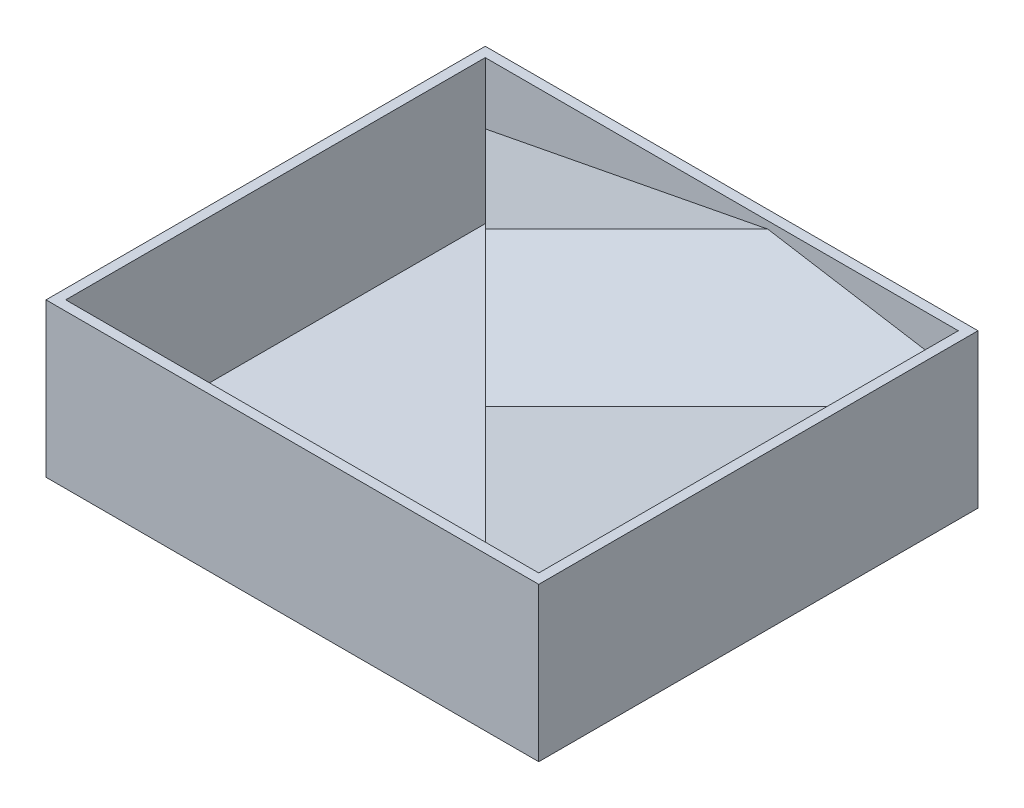
ISO-10303-21;
HEADER;
FILE_DESCRIPTION(('STEP AP214'),'2;1');
FILE_NAME('part.step','',(''),(''),'','','');
FILE_SCHEMA(('AUTOMOTIVE_DESIGN { 1 0 10303 214 1 1 1 1 }'));
ENDSEC;
DATA;
#1=APPLICATION_CONTEXT('core data for automotive mechanical design processes');
#2=APPLICATION_PROTOCOL_DEFINITION('international standard','automotive_design',2000,#1);
#3=PRODUCT_CONTEXT('',#1,'mechanical');
#4=PRODUCT('Part','Part','',(#3));
#5=PRODUCT_RELATED_PRODUCT_CATEGORY('part','',(#4));
#6=PRODUCT_DEFINITION_FORMATION('','',#4);
#7=PRODUCT_DEFINITION_CONTEXT('part definition',#1,'design');
#8=PRODUCT_DEFINITION('design','',#6,#7);
#9=PRODUCT_DEFINITION_SHAPE('','',#8);
#10=(LENGTH_UNIT() NAMED_UNIT(*) SI_UNIT(.MILLI.,.METRE.));
#11=(NAMED_UNIT(*) PLANE_ANGLE_UNIT() SI_UNIT($,.RADIAN.));
#12=(NAMED_UNIT(*) SI_UNIT($,.STERADIAN.) SOLID_ANGLE_UNIT());
#13=UNCERTAINTY_MEASURE_WITH_UNIT(LENGTH_MEASURE(1.E-05),#10,'distance_accuracy_value','');
#14=(GEOMETRIC_REPRESENTATION_CONTEXT(3) GLOBAL_UNCERTAINTY_ASSIGNED_CONTEXT((#13)) GLOBAL_UNIT_ASSIGNED_CONTEXT((#10,
#11,#12)) REPRESENTATION_CONTEXT('',''));
#15=CARTESIAN_POINT('',(0.,0.,0.));
#16=DIRECTION('',(0.,0.,1.));
#17=DIRECTION('',(1.,0.,0.));
#18=AXIS2_PLACEMENT_3D('',#15,#16,#17);
#19=CARTESIAN_POINT('',(62.0602912861796,39.624,-63.9370439423789));
#20=DIRECTION('',(-1.,0.,0.));
#21=DIRECTION('',(0.,0.,1.));
#22=AXIS2_PLACEMENT_3D('',#19,#20,#21);
#23=PLANE('',#22);
#24=DIRECTION('',(0.,-0.0967450022136603,-0.995309200473239));
#25=VECTOR('',#24,1.);
#26=CARTESIAN_POINT('',(62.0602912861796,24.2577204448423,-62.4434269348474));
#27=LINE('',#26,#25);
#28=CARTESIAN_POINT('',(62.0602912861796,34.8768301423718,46.8056023787655));
#29=VERTEX_POINT('',#28);
#30=CARTESIAN_POINT('',(62.0602912861796,25.357,-51.1340773032851));
#31=VERTEX_POINT('',#30);
#32=EDGE_CURVE('E51',#29,#31,#27,.T.);
#33=ORIENTED_EDGE('',*,*,#32,.T.);
#34=DIRECTION('',(0.,0.162584559288982,-0.986694613890644));
#35=VECTOR('',#34,1.);
#36=CARTESIAN_POINT('',(62.0602912861796,27.7879988198752,-65.8873444796714));
#37=LINE('',#36,#35);
#38=CARTESIAN_POINT('',(62.0602912861796,27.0481006551816,-61.397043942379));
#39=VERTEX_POINT('',#38);
#40=EDGE_CURVE('E190',#31,#39,#37,.T.);
#41=ORIENTED_EDGE('',*,*,#40,.T.);
#42=DIRECTION('',(0.,-1.,0.));
#43=VECTOR('',#42,1.);
#44=CARTESIAN_POINT('',(62.0602912861796,39.624,-61.397043942379));
#45=LINE('',#44,#43);
#46=CARTESIAN_POINT('',(62.0602912861796,2.54,-61.397043942379));
#47=VERTEX_POINT('',#46);
#48=EDGE_CURVE('E218',#39,#47,#45,.T.);
#49=ORIENTED_EDGE('',*,*,#48,.T.);
#50=DIRECTION('',(0.,0.,-1.));
#51=VECTOR('',#50,1.);
#52=CARTESIAN_POINT('',(62.0602912861796,2.54,-63.9370439423789));
#53=LINE('',#52,#51);
#54=CARTESIAN_POINT('',(62.0602912861796,2.54,46.8056023787655));
#55=VERTEX_POINT('',#54);
#56=EDGE_CURVE('E222',#55,#47,#53,.T.);
#57=ORIENTED_EDGE('',*,*,#56,.F.);
#58=DIRECTION('',(0.,-1.,0.));
#59=VECTOR('',#58,1.);
#60=CARTESIAN_POINT('',(62.0602912861796,39.624,46.8056023787655));
#61=LINE('',#60,#59);
#62=EDGE_CURVE('E227',#29,#55,#61,.T.);
#63=ORIENTED_EDGE('',*,*,#62,.F.);
#64=EDGE_LOOP('',(#33,#41,#49,#57,#63));
#65=FACE_BOUND('',#64,.T.);
#66=ADVANCED_FACE('F43',(#65),#23,.T.);
#67=CARTESIAN_POINT('',(-62.4778997860176,39.624,-61.397043942379));
#68=DIRECTION('',(0.,0.,1.));
#69=DIRECTION('',(1.,0.,0.));
#70=AXIS2_PLACEMENT_3D('',#67,#68,#69);
#71=PLANE('',#70);
#72=DIRECTION('',(-0.986694613890644,0.162584559288982,0.));
#73=VECTOR('',#72,1.);
#74=CARTESIAN_POINT('',(-61.2033319918938,47.3591083214804,-61.397043942379));
#75=LINE('',#74,#73);
#76=CARTESIAN_POINT('',(12.9885137023479,35.134,-61.397043942379));
#77=VERTEX_POINT('',#76);
#78=EDGE_CURVE('E272',#39,#77,#75,.T.);
#79=ORIENTED_EDGE('',*,*,#78,.T.);
#80=DIRECTION('',(-0.981937401623452,-0.189206076258095,0.));
#81=VECTOR('',#80,1.);
#82=CARTESIAN_POINT('',(-58.9420917631022,21.2739437474469,-61.397043942379));
#83=LINE('',#82,#81);
#84=CARTESIAN_POINT('',(-59.9378997860176,21.0820649897881,-61.397043942379));
#85=VERTEX_POINT('',#84);
#86=EDGE_CURVE('E274',#77,#85,#83,.T.);
#87=ORIENTED_EDGE('',*,*,#86,.T.);
#88=DIRECTION('',(0.,-1.,0.));
#89=VECTOR('',#88,1.);
#90=CARTESIAN_POINT('',(-59.9378997860176,39.624,-61.397043942379));
#91=LINE('',#90,#89);
#92=CARTESIAN_POINT('',(-59.9378997860176,2.54,-61.397043942379));
#93=VERTEX_POINT('',#92);
#94=EDGE_CURVE('E221',#85,#93,#91,.T.);
#95=ORIENTED_EDGE('',*,*,#94,.T.);
#96=DIRECTION('',(-1.,0.,0.));
#97=VECTOR('',#96,1.);
#98=CARTESIAN_POINT('',(-62.4778997860176,2.54,-61.397043942379));
#99=LINE('',#98,#97);
#100=EDGE_CURVE('E229',#47,#93,#99,.T.);
#101=ORIENTED_EDGE('',*,*,#100,.F.);
#102=ORIENTED_EDGE('',*,*,#48,.F.);
#103=EDGE_LOOP('',(#79,#87,#95,#101,#102));
#104=FACE_BOUND('',#103,.T.);
#105=ADVANCED_FACE('F308',(#104),#71,.T.);
#106=CARTESIAN_POINT('',(-62.4778997860176,39.624,-63.9370439423789));
#107=DIRECTION('',(1.,0.,0.));
#108=DIRECTION('',(0.,0.,-1.));
#109=AXIS2_PLACEMENT_3D('',#106,#107,#108);
#110=PLANE('',#109);
#111=DIRECTION('',(0.,0.,1.));
#112=VECTOR('',#111,1.);
#113=CARTESIAN_POINT('',(-62.4778997860176,0.,-63.9370439423789));
#114=LINE('',#113,#112);
#115=CARTESIAN_POINT('',(-62.4778997860176,0.,-63.9370439423789));
#116=VERTEX_POINT('',#115);
#117=CARTESIAN_POINT('',(-62.4778997860176,0.,49.3456023787655));
#118=VERTEX_POINT('',#117);
#119=EDGE_CURVE('E211',#116,#118,#114,.T.);
#120=ORIENTED_EDGE('',*,*,#119,.T.);
#121=DIRECTION('',(0.,-1.,0.));
#122=VECTOR('',#121,1.);
#123=CARTESIAN_POINT('',(-62.4778997860176,39.624,49.3456023787655));
#124=LINE('',#123,#122);
#125=CARTESIAN_POINT('',(-62.4778997860176,39.624,49.3456023787655));
#126=VERTEX_POINT('',#125);
#127=EDGE_CURVE('E268',#126,#118,#124,.T.);
#128=ORIENTED_EDGE('',*,*,#127,.F.);
#129=DIRECTION('',(0.,0.,1.));
#130=VECTOR('',#129,1.);
#131=CARTESIAN_POINT('',(-62.4778997860176,39.624,-63.9370439423789));
#132=LINE('',#131,#130);
#133=CARTESIAN_POINT('',(-62.4778997860176,39.624,-63.9370439423789));
#134=VERTEX_POINT('',#133);
#135=EDGE_CURVE('E245',#134,#126,#132,.T.);
#136=ORIENTED_EDGE('',*,*,#135,.F.);
#137=DIRECTION('',(0.,-1.,0.));
#138=VECTOR('',#137,1.);
#139=CARTESIAN_POINT('',(-62.4778997860176,39.624,-63.9370439423789));
#140=LINE('',#139,#138);
#141=EDGE_CURVE('E255',#134,#116,#140,.T.);
#142=ORIENTED_EDGE('',*,*,#141,.T.);
#143=EDGE_LOOP('',(#120,#128,#136,#142));
#144=FACE_BOUND('',#143,.T.);
#145=ADVANCED_FACE('F44',(#144),#110,.F.);
#146=CARTESIAN_POINT('',(-62.4778997860176,39.624,49.3456023787655));
#147=DIRECTION('',(0.,0.,-1.));
#148=DIRECTION('',(-1.,0.,0.));
#149=AXIS2_PLACEMENT_3D('',#146,#147,#148);
#150=PLANE('',#149);
#151=DIRECTION('',(1.,0.,0.));
#152=VECTOR('',#151,1.);
#153=CARTESIAN_POINT('',(-62.4778997860176,0.,49.3456023787655));
#154=LINE('',#153,#152);
#155=CARTESIAN_POINT('',(64.6002912861796,0.,49.3456023787655));
#156=VERTEX_POINT('',#155);
#157=EDGE_CURVE('E253',#118,#156,#154,.T.);
#158=ORIENTED_EDGE('',*,*,#157,.T.);
#159=DIRECTION('',(0.,-1.,0.));
#160=VECTOR('',#159,1.);
#161=CARTESIAN_POINT('',(64.6002912861796,39.624,49.3456023787655));
#162=LINE('',#161,#160);
#163=CARTESIAN_POINT('',(64.6002912861796,39.624,49.3456023787655));
#164=VERTEX_POINT('',#163);
#165=EDGE_CURVE('E266',#164,#156,#162,.T.);
#166=ORIENTED_EDGE('',*,*,#165,.F.);
#167=DIRECTION('',(1.,0.,0.));
#168=VECTOR('',#167,1.);
#169=CARTESIAN_POINT('',(-62.4778997860176,39.624,49.3456023787655));
#170=LINE('',#169,#168);
#171=EDGE_CURVE('E244',#126,#164,#170,.T.);
#172=ORIENTED_EDGE('',*,*,#171,.F.);
#173=ORIENTED_EDGE('',*,*,#127,.T.);
#174=EDGE_LOOP('',(#158,#166,#172,#173));
#175=FACE_BOUND('',#174,.T.);
#176=ADVANCED_FACE('F328',(#175),#150,.F.);
#177=CARTESIAN_POINT('',(64.6002912861796,39.624,-63.9370439423789));
#178=DIRECTION('',(-1.,0.,0.));
#179=DIRECTION('',(0.,0.,1.));
#180=AXIS2_PLACEMENT_3D('',#177,#178,#179);
#181=PLANE('',#180);
#182=DIRECTION('',(0.,0.,-1.));
#183=VECTOR('',#182,1.);
#184=CARTESIAN_POINT('',(64.6002912861796,0.,-63.9370439423789));
#185=LINE('',#184,#183);
#186=CARTESIAN_POINT('',(64.6002912861796,0.,-63.9370439423789));
#187=VERTEX_POINT('',#186);
#188=EDGE_CURVE('E259',#156,#187,#185,.T.);
#189=ORIENTED_EDGE('',*,*,#188,.T.);
#190=DIRECTION('',(0.,-1.,0.));
#191=VECTOR('',#190,1.);
#192=CARTESIAN_POINT('',(64.6002912861796,39.624,-63.9370439423789));
#193=LINE('',#192,#191);
#194=CARTESIAN_POINT('',(64.6002912861796,39.624,-63.9370439423789));
#195=VERTEX_POINT('',#194);
#196=EDGE_CURVE('E263',#195,#187,#193,.T.);
#197=ORIENTED_EDGE('',*,*,#196,.F.);
#198=DIRECTION('',(0.,0.,-1.));
#199=VECTOR('',#198,1.);
#200=CARTESIAN_POINT('',(64.6002912861796,39.624,-63.9370439423789));
#201=LINE('',#200,#199);
#202=EDGE_CURVE('E247',#164,#195,#201,.T.);
#203=ORIENTED_EDGE('',*,*,#202,.F.);
#204=ORIENTED_EDGE('',*,*,#165,.T.);
#205=EDGE_LOOP('',(#189,#197,#203,#204));
#206=FACE_BOUND('',#205,.T.);
#207=ADVANCED_FACE('F332',(#206),#181,.F.);
#208=CARTESIAN_POINT('',(-62.4778997860176,39.624,-63.9370439423789));
#209=DIRECTION('',(0.,0.,1.));
#210=DIRECTION('',(1.,0.,0.));
#211=AXIS2_PLACEMENT_3D('',#208,#209,#210);
#212=PLANE('',#211);
#213=DIRECTION('',(-1.,0.,0.));
#214=VECTOR('',#213,1.);
#215=CARTESIAN_POINT('',(-62.4778997860176,0.,-63.9370439423789));
#216=LINE('',#215,#214);
#217=EDGE_CURVE('E246',#187,#116,#216,.T.);
#218=ORIENTED_EDGE('',*,*,#217,.T.);
#219=ORIENTED_EDGE('',*,*,#141,.F.);
#220=DIRECTION('',(-1.,0.,0.));
#221=VECTOR('',#220,1.);
#222=CARTESIAN_POINT('',(-62.4778997860176,39.624,-63.9370439423789));
#223=LINE('',#222,#221);
#224=EDGE_CURVE('E249',#195,#134,#223,.T.);
#225=ORIENTED_EDGE('',*,*,#224,.F.);
#226=ORIENTED_EDGE('',*,*,#196,.T.);
#227=EDGE_LOOP('',(#218,#219,#225,#226));
#228=FACE_BOUND('',#227,.T.);
#229=ADVANCED_FACE('F316',(#228),#212,.F.);
#230=CARTESIAN_POINT('',(0.,39.624,0.));
#231=DIRECTION('',(0.,1.,0.));
#232=DIRECTION('',(0.,0.,1.));
#233=AXIS2_PLACEMENT_3D('',#230,#231,#232);
#234=PLANE('',#233);
#235=DIRECTION('',(0.,0.,1.));
#236=VECTOR('',#235,1.);
#237=CARTESIAN_POINT('',(-59.9378997860176,39.624,-63.9370439423789));
#238=LINE('',#237,#236);
#239=CARTESIAN_POINT('',(-59.9378997860176,39.624,-61.397043942379));
#240=VERTEX_POINT('',#239);
#241=CARTESIAN_POINT('',(-59.9378997860176,39.624,46.8056023787655));
#242=VERTEX_POINT('',#241);
#243=EDGE_CURVE('E234',#240,#242,#238,.T.);
#244=ORIENTED_EDGE('',*,*,#243,.F.);
#245=DIRECTION('',(-1.,0.,0.));
#246=VECTOR('',#245,1.);
#247=CARTESIAN_POINT('',(-62.4778997860176,39.624,-61.397043942379));
#248=LINE('',#247,#246);
#249=CARTESIAN_POINT('',(62.0602912861796,39.624,-61.397043942379));
#250=VERTEX_POINT('',#249);
#251=EDGE_CURVE('E239',#250,#240,#248,.T.);
#252=ORIENTED_EDGE('',*,*,#251,.F.);
#253=DIRECTION('',(0.,0.,-1.));
#254=VECTOR('',#253,1.);
#255=CARTESIAN_POINT('',(62.0602912861796,39.624,-63.9370439423789));
#256=LINE('',#255,#254);
#257=CARTESIAN_POINT('',(62.0602912861796,39.624,46.8056023787655));
#258=VERTEX_POINT('',#257);
#259=EDGE_CURVE('E238',#258,#250,#256,.T.);
#260=ORIENTED_EDGE('',*,*,#259,.F.);
#261=DIRECTION('',(1.,0.,0.));
#262=VECTOR('',#261,1.);
#263=CARTESIAN_POINT('',(-62.4778997860176,39.624,46.8056023787655));
#264=LINE('',#263,#262);
#265=EDGE_CURVE('E236',#242,#258,#264,.T.);
#266=ORIENTED_EDGE('',*,*,#265,.F.);
#267=EDGE_LOOP('',(#244,#252,#260,#266));
#268=FACE_BOUND('',#267,.T.);
#269=ORIENTED_EDGE('',*,*,#135,.T.);
#270=ORIENTED_EDGE('',*,*,#171,.T.);
#271=ORIENTED_EDGE('',*,*,#202,.T.);
#272=ORIENTED_EDGE('',*,*,#224,.T.);
#273=EDGE_LOOP('',(#269,#270,#271,#272));
#274=FACE_BOUND('',#273,.T.);
#275=ADVANCED_FACE('F313',(#268,#274),#234,.T.);
#276=CARTESIAN_POINT('',(0.,0.,0.));
#277=DIRECTION('',(0.,1.,0.));
#278=DIRECTION('',(0.,0.,1.));
#279=AXIS2_PLACEMENT_3D('',#276,#277,#278);
#280=PLANE('',#279);
#281=ORIENTED_EDGE('',*,*,#119,.F.);
#282=ORIENTED_EDGE('',*,*,#217,.F.);
#283=ORIENTED_EDGE('',*,*,#188,.F.);
#284=ORIENTED_EDGE('',*,*,#157,.F.);
#285=EDGE_LOOP('',(#281,#282,#283,#284));
#286=FACE_BOUND('',#285,.T.);
#287=ADVANCED_FACE('F319',(#286),#280,.F.);
#288=CARTESIAN_POINT('',(-59.9378997860176,39.624,-63.9370439423789));
#289=DIRECTION('',(1.,0.,0.));
#290=DIRECTION('',(0.,0.,-1.));
#291=AXIS2_PLACEMENT_3D('',#288,#289,#290);
#292=PLANE('',#291);
#293=DIRECTION('',(0.,0.,1.));
#294=VECTOR('',#293,1.);
#295=CARTESIAN_POINT('',(-59.9378997860176,2.54,-63.9370439423789));
#296=LINE('',#295,#294);
#297=CARTESIAN_POINT('',(-59.9378997860176,2.54,46.8056023787655));
#298=VERTEX_POINT('',#297);
#299=EDGE_CURVE('E198',#93,#298,#296,.T.);
#300=ORIENTED_EDGE('',*,*,#299,.F.);
#301=ORIENTED_EDGE('',*,*,#94,.F.);
#302=CARTESIAN_POINT('',(-59.9378997860176,23.7146817699346,-61.397043942379));
#303=VERTEX_POINT('',#302);
#304=EDGE_CURVE('E220',#303,#85,#91,.T.);
#305=ORIENTED_EDGE('',*,*,#304,.F.);
#306=EDGE_CURVE('E216',#240,#303,#91,.T.);
#307=ORIENTED_EDGE('',*,*,#306,.F.);
#308=ORIENTED_EDGE('',*,*,#243,.T.);
#309=DIRECTION('',(0.,-1.,0.));
#310=VECTOR('',#309,1.);
#311=CARTESIAN_POINT('',(-59.9378997860176,39.624,46.8056023787655));
#312=LINE('',#311,#310);
#313=EDGE_CURVE('E212',#242,#298,#312,.T.);
#314=ORIENTED_EDGE('',*,*,#313,.T.);
#315=EDGE_LOOP('',(#300,#301,#305,#307,#308,#314));
#316=FACE_BOUND('',#315,.T.);
#317=ADVANCED_FACE('F302',(#316),#292,.T.);
#318=CARTESIAN_POINT('',(-62.4778997860176,39.624,46.8056023787655));
#319=DIRECTION('',(0.,0.,-1.));
#320=DIRECTION('',(-1.,0.,0.));
#321=AXIS2_PLACEMENT_3D('',#318,#319,#320);
#322=PLANE('',#321);
#323=DIRECTION('',(0.995309200473239,0.0967450022136603,0.));
#324=VECTOR('',#323,1.);
#325=CARTESIAN_POINT('',(-61.1020416653543,25.4692197559756,46.8056023787655));
#326=LINE('',#325,#324);
#327=CARTESIAN_POINT('',(48.2647465351268,36.0997757294617,46.8056023787655));
#328=VERTEX_POINT('',#327);
#329=CARTESIAN_POINT('',(62.0602912861796,37.440715818074,46.8056023787655));
#330=VERTEX_POINT('',#329);
#331=EDGE_CURVE('E197',#328,#330,#326,.T.);
#332=ORIENTED_EDGE('',*,*,#331,.F.);
#333=DIRECTION('',(0.,1.,0.));
#334=VECTOR('',#333,1.);
#335=CARTESIAN_POINT('',(48.2647465351269,39.624,46.8056023787655));
#336=LINE('',#335,#334);
#337=CARTESIAN_POINT('',(48.2647465351268,33.5358900537595,46.8056023787655));
#338=VERTEX_POINT('',#337);
#339=EDGE_CURVE('E174',#338,#328,#336,.T.);
#340=ORIENTED_EDGE('',*,*,#339,.F.);
#341=DIRECTION('',(0.995309200473239,0.0967450022136603,0.));
#342=VECTOR('',#341,1.);
#343=CARTESIAN_POINT('',(-60.855162060558,22.9293310129866,46.8056023787655));
#344=LINE('',#343,#342);
#345=EDGE_CURVE('E200',#338,#29,#344,.T.);
#346=ORIENTED_EDGE('',*,*,#345,.T.);
#347=ORIENTED_EDGE('',*,*,#62,.T.);
#348=DIRECTION('',(1.,0.,0.));
#349=VECTOR('',#348,1.);
#350=CARTESIAN_POINT('',(-62.4778997860176,2.54,46.8056023787655));
#351=LINE('',#350,#349);
#352=EDGE_CURVE('E208',#298,#55,#351,.T.);
#353=ORIENTED_EDGE('',*,*,#352,.F.);
#354=ORIENTED_EDGE('',*,*,#313,.F.);
#355=ORIENTED_EDGE('',*,*,#265,.T.);
#356=EDGE_CURVE('E213',#258,#330,#61,.T.);
#357=ORIENTED_EDGE('',*,*,#356,.T.);
#358=EDGE_LOOP('',(#332,#340,#346,#347,#353,#354,#355,#357));
#359=FACE_BOUND('',#358,.T.);
#360=ADVANCED_FACE('F287',(#359),#322,.T.);
#361=DIRECTION('',(0.,0.162584559288982,-0.986694613890644));
#362=VECTOR('',#361,1.);
#363=CARTESIAN_POINT('',(62.0602912861796,30.3271112617618,-65.4689571979961));
#364=LINE('',#363,#362);
#365=CARTESIAN_POINT('',(62.0602912861796,27.9372729695821,-50.9654853967646));
#366=VERTEX_POINT('',#365);
#367=CARTESIAN_POINT('',(62.0602912861796,29.6561536900801,-61.397043942379));
#368=VERTEX_POINT('',#367);
#369=EDGE_CURVE('E205',#366,#368,#364,.T.);
#370=ORIENTED_EDGE('',*,*,#369,.F.);
#371=DIRECTION('',(0.,-0.0967450022136603,-0.995309200473239));
#372=VECTOR('',#371,1.);
#373=CARTESIAN_POINT('',(62.0602912861796,26.7976091878313,-62.6903065396437));
#374=LINE('',#373,#372);
#375=EDGE_CURVE('E11',#330,#366,#374,.T.);
#376=ORIENTED_EDGE('',*,*,#375,.F.);
#377=ORIENTED_EDGE('',*,*,#356,.F.);
#378=ORIENTED_EDGE('',*,*,#259,.T.);
#379=EDGE_CURVE('E66',#250,#368,#45,.T.);
#380=ORIENTED_EDGE('',*,*,#379,.T.);
#381=EDGE_LOOP('',(#370,#376,#377,#378,#380));
#382=FACE_BOUND('',#381,.T.);
#383=ADVANCED_FACE('F292',(#382),#23,.T.);
#384=DIRECTION('',(-0.981937401623452,-0.189206076258095,0.));
#385=VECTOR('',#384,1.);
#386=CARTESIAN_POINT('',(-59.431201746027,23.8123156392992,-61.397043942379));
#387=LINE('',#386,#385);
#388=CARTESIAN_POINT('',(12.9197969049129,37.753375981299,-61.397043942379));
#389=VERTEX_POINT('',#388);
#390=EDGE_CURVE('E276',#389,#303,#387,.T.);
#391=ORIENTED_EDGE('',*,*,#390,.F.);
#392=DIRECTION('',(-0.986694613890644,0.162584559288982,0.));
#393=VECTOR('',#392,1.);
#394=CARTESIAN_POINT('',(-60.7849447102186,49.8982207633671,-61.397043942379));
#395=LINE('',#394,#393);
#396=EDGE_CURVE('E280',#368,#389,#395,.T.);
#397=ORIENTED_EDGE('',*,*,#396,.F.);
#398=ORIENTED_EDGE('',*,*,#379,.F.);
#399=ORIENTED_EDGE('',*,*,#251,.T.);
#400=ORIENTED_EDGE('',*,*,#306,.T.);
#401=EDGE_LOOP('',(#391,#397,#398,#399,#400));
#402=FACE_BOUND('',#401,.T.);
#403=ADVANCED_FACE('F294',(#402),#71,.T.);
#404=CARTESIAN_POINT('',(0.,2.54,0.));
#405=DIRECTION('',(0.,1.,0.));
#406=DIRECTION('',(0.,0.,1.));
#407=AXIS2_PLACEMENT_3D('',#404,#405,#406);
#408=PLANE('',#407);
#409=ORIENTED_EDGE('',*,*,#299,.T.);
#410=ORIENTED_EDGE('',*,*,#352,.T.);
#411=ORIENTED_EDGE('',*,*,#56,.T.);
#412=ORIENTED_EDGE('',*,*,#100,.T.);
#413=EDGE_LOOP('',(#409,#410,#411,#412));
#414=FACE_BOUND('',#413,.T.);
#415=ADVANCED_FACE('F309',(#414),#408,.T.);
#416=CARTESIAN_POINT('',(79.5818776754174,39.624,78.122733519056));
#417=DIRECTION('',(-0.707106781186547,0.,0.707106781186548));
#418=DIRECTION('',(0.700519231896705,0.136182273022966,0.700519231896705));
#419=AXIS2_PLACEMENT_3D('',#416,#417,#418);
#420=PLANE('',#419);
#421=DIRECTION('',(0.700519231896705,0.136182273022966,0.700519231896705));
#422=VECTOR('',#421,1.);
#423=CARTESIAN_POINT('',(6.19267906962794,25.357,4.73353491326659));
#424=LINE('',#423,#422);
#425=CARTESIAN_POINT('',(6.19267906962794,25.357,4.73353491326659));
#426=VERTEX_POINT('',#425);
#427=EDGE_CURVE('E192',#426,#338,#424,.T.);
#428=ORIENTED_EDGE('',*,*,#427,.T.);
#429=ORIENTED_EDGE('',*,*,#339,.T.);
#430=DIRECTION('',(0.700519231896705,0.136182273022966,0.700519231896705));
#431=VECTOR('',#430,1.);
#432=CARTESIAN_POINT('',(5.94808873144882,27.8733368480668,4.48894457508747));
#433=LINE('',#432,#431);
#434=CARTESIAN_POINT('',(6.27697502288816,27.9372729695821,4.81783086652681));
#435=VERTEX_POINT('',#434);
#436=EDGE_CURVE('E171',#435,#328,#433,.T.);
#437=ORIENTED_EDGE('',*,*,#436,.F.);
#438=DIRECTION('',(0.688655943794372,-0.226949294234123,0.688655943794372));
#439=VECTOR('',#438,1.);
#440=CARTESIAN_POINT('',(-23.0670804840912,37.607722701828,-24.5262246404525));
#441=LINE('',#440,#439);
#442=CARTESIAN_POINT('',(-23.5090514405523,37.753375981299,-24.9681955969137));
#443=VERTEX_POINT('',#442);
#444=EDGE_CURVE('E158',#443,#435,#441,.T.);
#445=ORIENTED_EDGE('',*,*,#444,.F.);
#446=DIRECTION('',(0.682230409590376,0.262913172854267,0.682230409590375));
#447=VECTOR('',#446,1.);
#448=CARTESIAN_POINT('',(-60.4102739532484,23.5326415246814,-61.8694181096097));
#449=LINE('',#448,#447);
#450=EDGE_CURVE('E166',#303,#443,#449,.T.);
#451=ORIENTED_EDGE('',*,*,#450,.F.);
#452=ORIENTED_EDGE('',*,*,#304,.T.);
#453=DIRECTION('',(0.682230409590376,0.262913172854267,0.682230409590375));
#454=VECTOR('',#453,1.);
#455=CARTESIAN_POINT('',(-59.9380684272816,21.082,-61.3972125836429));
#456=LINE('',#455,#454);
#457=CARTESIAN_POINT('',(-23.4746930418348,35.134,-24.9338371981962));
#458=VERTEX_POINT('',#457);
#459=EDGE_CURVE('E181',#85,#458,#456,.T.);
#460=ORIENTED_EDGE('',*,*,#459,.T.);
#461=DIRECTION('',(0.688655943794372,-0.226949294234123,0.688655943794372));
#462=VECTOR('',#461,1.);
#463=CARTESIAN_POINT('',(-23.4746930418348,35.134,-24.9338371981962));
#464=LINE('',#463,#462);
#465=EDGE_CURVE('E182',#458,#426,#464,.T.);
#466=ORIENTED_EDGE('',*,*,#465,.T.);
#467=EDGE_LOOP('',(#428,#429,#437,#445,#451,#452,#460,#466));
#468=FACE_BOUND('',#467,.T.);
#469=ADVANCED_FACE('F173',(#468),#420,.T.);
#470=CARTESIAN_POINT('',(-60.4102739532484,23.5326415246814,-61.8694181096097));
#471=DIRECTION('',(-0.185907687388523,0.96481949790606,-0.185907687388523));
#472=DIRECTION('',(-0.981937401623452,-0.189206076258095,0.));
#473=AXIS2_PLACEMENT_3D('',#470,#471,#472);
#474=PLANE('',#473);
#475=DIRECTION('',(0.707106781186547,0.,-0.707106781186548));
#476=VECTOR('',#475,1.);
#477=CARTESIAN_POINT('',(-23.5090514405524,37.753375981299,-24.9681955969137));
#478=LINE('',#477,#476);
#479=EDGE_CURVE('E164',#443,#389,#478,.T.);
#480=ORIENTED_EDGE('',*,*,#479,.T.);
#481=ORIENTED_EDGE('',*,*,#390,.T.);
#482=ORIENTED_EDGE('',*,*,#450,.T.);
#483=EDGE_LOOP('',(#480,#481,#482));
#484=FACE_BOUND('',#483,.T.);
#485=ADVANCED_FACE('F296',(#484),#474,.T.);
#486=CARTESIAN_POINT('',(-23.0670804840912,37.607722701828,-24.5262246404525));
#487=DIRECTION('',(0.160477384938449,0.973906575522844,0.160477384938449));
#488=DIRECTION('',(-0.986694613890644,0.162584559288982,0.));
#489=AXIS2_PLACEMENT_3D('',#486,#487,#488);
#490=PLANE('',#489);
#491=DIRECTION('',(0.707106781186547,0.,-0.707106781186548));
#492=VECTOR('',#491,1.);
#493=CARTESIAN_POINT('',(6.27697502288816,27.9372729695821,4.81783086652681));
#494=LINE('',#493,#492);
#495=EDGE_CURVE('E162',#435,#366,#494,.T.);
#496=ORIENTED_EDGE('',*,*,#495,.T.);
#497=ORIENTED_EDGE('',*,*,#369,.T.);
#498=ORIENTED_EDGE('',*,*,#396,.T.);
#499=ORIENTED_EDGE('',*,*,#479,.F.);
#500=ORIENTED_EDGE('',*,*,#444,.T.);
#501=EDGE_LOOP('',(#496,#497,#498,#499,#500));
#502=FACE_BOUND('',#501,.T.);
#503=ADVANCED_FACE('F159',(#502),#490,.T.);
#504=CARTESIAN_POINT('',(5.94808873144882,27.8733368480668,4.48894457508747));
#505=DIRECTION('',(-0.0962954087319371,0.990683798451503,-0.0962954087319371));
#506=DIRECTION('',(-0.995309200473239,-0.0967450022136603,0.));
#507=AXIS2_PLACEMENT_3D('',#504,#505,#506);
#508=PLANE('',#507);
#509=ORIENTED_EDGE('',*,*,#436,.T.);
#510=ORIENTED_EDGE('',*,*,#331,.T.);
#511=ORIENTED_EDGE('',*,*,#375,.T.);
#512=ORIENTED_EDGE('',*,*,#495,.F.);
#513=EDGE_LOOP('',(#509,#510,#511,#512));
#514=FACE_BOUND('',#513,.T.);
#515=ADVANCED_FACE('F177',(#514),#508,.T.);
#516=CARTESIAN_POINT('',(-59.9380684272816,21.082,-61.3972125836429));
#517=DIRECTION('',(-0.185907687388523,0.96481949790606,-0.185907687388523));
#518=DIRECTION('',(-0.981937401623452,-0.189206076258095,0.));
#519=AXIS2_PLACEMENT_3D('',#516,#517,#518);
#520=PLANE('',#519);
#521=ORIENTED_EDGE('',*,*,#86,.F.);
#522=DIRECTION('',(0.707106781186547,0.,-0.707106781186548));
#523=VECTOR('',#522,1.);
#524=CARTESIAN_POINT('',(-23.4746930418348,35.134,-24.9338371981962));
#525=LINE('',#524,#523);
#526=EDGE_CURVE('E59',#458,#77,#525,.T.);
#527=ORIENTED_EDGE('',*,*,#526,.F.);
#528=ORIENTED_EDGE('',*,*,#459,.F.);
#529=EDGE_LOOP('',(#521,#527,#528));
#530=FACE_BOUND('',#529,.T.);
#531=ADVANCED_FACE('F361',(#530),#520,.F.);
#532=CARTESIAN_POINT('',(-23.4746930418348,35.134,-24.9338371981962));
#533=DIRECTION('',(0.160477384938449,0.973906575522844,0.160477384938449));
#534=DIRECTION('',(-0.986694613890644,0.162584559288982,0.));
#535=AXIS2_PLACEMENT_3D('',#532,#533,#534);
#536=PLANE('',#535);
#537=ORIENTED_EDGE('',*,*,#40,.F.);
#538=DIRECTION('',(0.707106781186547,0.,-0.707106781186548));
#539=VECTOR('',#538,1.);
#540=CARTESIAN_POINT('',(6.19267906962794,25.357,4.73353491326659));
#541=LINE('',#540,#539);
#542=EDGE_CURVE('E194',#426,#31,#541,.T.);
#543=ORIENTED_EDGE('',*,*,#542,.F.);
#544=ORIENTED_EDGE('',*,*,#465,.F.);
#545=ORIENTED_EDGE('',*,*,#526,.T.);
#546=ORIENTED_EDGE('',*,*,#78,.F.);
#547=EDGE_LOOP('',(#537,#543,#544,#545,#546));
#548=FACE_BOUND('',#547,.T.);
#549=ADVANCED_FACE('F366',(#548),#536,.F.);
#550=CARTESIAN_POINT('',(6.19267906962794,25.357,4.73353491326659));
#551=DIRECTION('',(-0.0962954087319371,0.990683798451503,-0.0962954087319371));
#552=DIRECTION('',(-0.995309200473239,-0.0967450022136603,0.));
#553=AXIS2_PLACEMENT_3D('',#550,#551,#552);
#554=PLANE('',#553);
#555=ORIENTED_EDGE('',*,*,#345,.F.);
#556=ORIENTED_EDGE('',*,*,#427,.F.);
#557=ORIENTED_EDGE('',*,*,#542,.T.);
#558=ORIENTED_EDGE('',*,*,#32,.F.);
#559=EDGE_LOOP('',(#555,#556,#557,#558));
#560=FACE_BOUND('',#559,.T.);
#561=ADVANCED_FACE('F286',(#560),#554,.F.);
#562=CLOSED_SHELL('',(#66,#105,#145,#176,#207,#229,#275,#287,#317,#360,#383,#403,#415,#469,#485,
#503,#515,#531,#549,#561));
#563=MANIFOLD_SOLID_BREP('B2',#562);
#564=ADVANCED_BREP_SHAPE_REPRESENTATION('',(#18,#563),#14);
#565=SHAPE_DEFINITION_REPRESENTATION(#9,#564);
ENDSEC;
END-ISO-10303-21;
